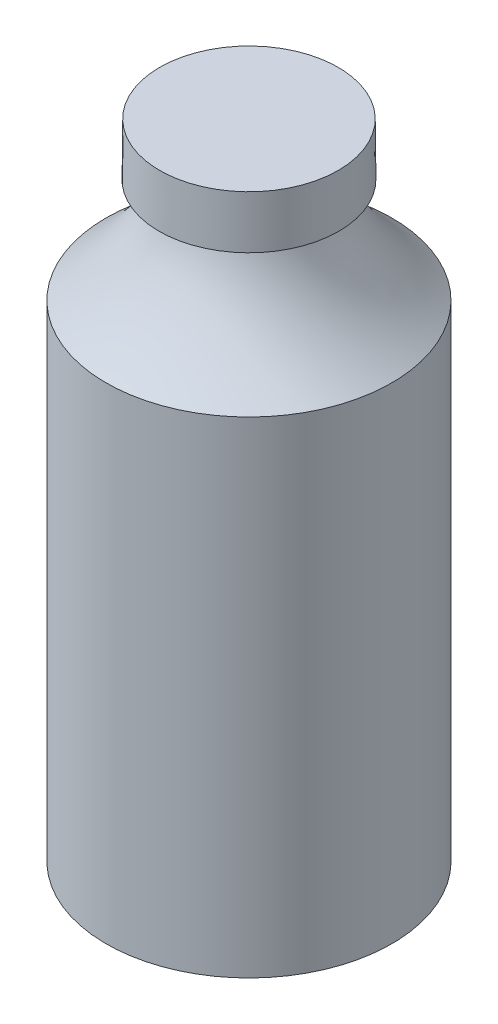
ISO-10303-21;
HEADER;
FILE_DESCRIPTION(('STEP AP214'),'2;1');
FILE_NAME('part.step','',(''),(''),'','','');
FILE_SCHEMA(('AUTOMOTIVE_DESIGN { 1 0 10303 214 1 1 1 1 }'));
ENDSEC;
DATA;
#1=APPLICATION_CONTEXT('core data for automotive mechanical design processes');
#2=APPLICATION_PROTOCOL_DEFINITION('international standard','automotive_design',2000,#1);
#3=PRODUCT_CONTEXT('',#1,'mechanical');
#4=PRODUCT('Part','Part','',(#3));
#5=PRODUCT_RELATED_PRODUCT_CATEGORY('part','',(#4));
#6=PRODUCT_DEFINITION_FORMATION('','',#4);
#7=PRODUCT_DEFINITION_CONTEXT('part definition',#1,'design');
#8=PRODUCT_DEFINITION('design','',#6,#7);
#9=PRODUCT_DEFINITION_SHAPE('','',#8);
#10=(LENGTH_UNIT() NAMED_UNIT(*) SI_UNIT(.MILLI.,.METRE.));
#11=(NAMED_UNIT(*) PLANE_ANGLE_UNIT() SI_UNIT($,.RADIAN.));
#12=(NAMED_UNIT(*) SI_UNIT($,.STERADIAN.) SOLID_ANGLE_UNIT());
#13=UNCERTAINTY_MEASURE_WITH_UNIT(LENGTH_MEASURE(1.E-05),#10,'distance_accuracy_value','');
#14=(GEOMETRIC_REPRESENTATION_CONTEXT(3) GLOBAL_UNCERTAINTY_ASSIGNED_CONTEXT((#13)) GLOBAL_UNIT_ASSIGNED_CONTEXT((#10,
#11,#12)) REPRESENTATION_CONTEXT('',''));
#15=CARTESIAN_POINT('',(0.,0.,0.));
#16=DIRECTION('',(0.,0.,1.));
#17=DIRECTION('',(1.,0.,0.));
#18=AXIS2_PLACEMENT_3D('',#15,#16,#17);
#19=CARTESIAN_POINT('',(-6.16409861325116,-111.39406779661,0.));
#20=DIRECTION('',(0.,-1.,0.));
#21=DIRECTION('',(1.,0.,0.));
#22=AXIS2_PLACEMENT_3D('',#19,#20,#21);
#23=PLANE('',#22);
#24=CARTESIAN_POINT('',(-6.16409861325116,-111.39406779661,0.));
#25=DIRECTION('',(0.,1.,0.));
#26=DIRECTION('',(-1.,0.,0.));
#27=AXIS2_PLACEMENT_3D('',#24,#25,#26);
#28=CIRCLE('',#27,50.8);
#29=CARTESIAN_POINT('',(-56.9640986132512,-111.39406779661,0.));
#30=VERTEX_POINT('',#29);
#31=EDGE_CURVE('E46',#30,#30,#28,.T.);
#32=ORIENTED_EDGE('',*,*,#31,.F.);
#33=EDGE_LOOP('',(#32));
#34=FACE_BOUND('',#33,.T.);
#35=ADVANCED_FACE('F39',(#34),#23,.T.);
#36=CARTESIAN_POINT('',(-6.16409861325119,117.20593220339,0.));
#37=DIRECTION('',(0.,1.,0.));
#38=DIRECTION('',(-1.,0.,0.));
#39=AXIS2_PLACEMENT_3D('',#36,#37,#38);
#40=CYLINDRICAL_SURFACE('',#39,50.8);
#41=ORIENTED_EDGE('',*,*,#31,.T.);
#42=EDGE_LOOP('',(#41));
#43=FACE_BOUND('',#42,.T.);
#44=CARTESIAN_POINT('',(-6.16409861325119,61.3259322033898,0.));
#45=DIRECTION('',(0.,1.,0.));
#46=DIRECTION('',(-1.,0.,0.));
#47=AXIS2_PLACEMENT_3D('',#44,#45,#46);
#48=CIRCLE('',#47,50.8);
#49=CARTESIAN_POINT('',(-56.9640986132512,61.3259322033898,0.));
#50=VERTEX_POINT('',#49);
#51=EDGE_CURVE('E50',#50,#50,#48,.T.);
#52=ORIENTED_EDGE('',*,*,#51,.F.);
#53=EDGE_LOOP('',(#52));
#54=FACE_BOUND('',#53,.T.);
#55=ADVANCED_FACE('F71',(#43,#54),#40,.T.);
#56=CARTESIAN_POINT('',(-31.5640986132512,117.20593220339,0.));
#57=CARTESIAN_POINT('',(-26.356120569538,85.7287942430536,0.));
#58=CARTESIAN_POINT('',(-56.9640986132512,61.3259322033898,0.));
#59=B_SPLINE_CURVE_WITH_KNOTS('',2,(#56,#57,#58),.UNSPECIFIED.,.F.,.F.,(3,3),(0.,1.),.UNSPECIFIED.);
#60=CARTESIAN_POINT('',(-6.16409861325119,117.20593220339,0.));
#61=DIRECTION('',(0.,1.,0.));
#62=AXIS1_PLACEMENT('',#60,#61);
#63=SURFACE_OF_REVOLUTION('',#59,#62);
#64=CARTESIAN_POINT('',(-6.16409861325119,98.5444619241905,0.));
#65=DIRECTION('',(0.,1.,0.));
#66=DIRECTION('',(-1.,0.,0.));
#67=AXIS2_PLACEMENT_3D('',#64,#65,#66);
#68=CIRCLE('',#67,25.5781666043596);
#69=CARTESIAN_POINT('',(-31.7422652176108,98.5444619241905,0.));
#70=VERTEX_POINT('',#69);
#71=EDGE_CURVE('E10',#70,#70,#68,.T.);
#72=ORIENTED_EDGE('',*,*,#71,.F.);
#73=EDGE_LOOP('',(#72));
#74=FACE_BOUND('',#73,.T.);
#75=ORIENTED_EDGE('',*,*,#51,.T.);
#76=EDGE_LOOP('',(#75));
#77=FACE_BOUND('',#76,.T.);
#78=ADVANCED_FACE('F66',(#74,#77),#63,.F.);
#79=CARTESIAN_POINT('',(-6.16409861325119,98.5444619242105,0.));
#80=DIRECTION('',(0.,-1.,0.));
#81=DIRECTION('',(1.,0.,0.));
#82=AXIS2_PLACEMENT_3D('',#79,#80,#81);
#83=CONICAL_SURFACE('',#82,31.9281666044178,0.00954700799820233);
#84=CARTESIAN_POINT('',(-6.16409861325119,117.205932119238,0.));
#85=DIRECTION('',(0.,-1.,0.));
#86=DIRECTION('',(1.,0.,0.));
#87=AXIS2_PLACEMENT_3D('',#84,#85,#86);
#88=CIRCLE('',#87,31.7499999861544);
#89=CARTESIAN_POINT('',(25.5859013729032,117.205932119238,0.));
#90=VERTEX_POINT('',#89);
#91=EDGE_CURVE('E54',#90,#90,#88,.T.);
#92=ORIENTED_EDGE('',*,*,#91,.T.);
#93=EDGE_LOOP('',(#92));
#94=FACE_BOUND('',#93,.T.);
#95=CARTESIAN_POINT('',(-6.16409861325119,98.5444619242105,0.));
#96=DIRECTION('',(0.,-1.,0.));
#97=DIRECTION('',(1.,0.,0.));
#98=AXIS2_PLACEMENT_3D('',#95,#96,#97);
#99=CIRCLE('',#98,31.9281666044178);
#100=CARTESIAN_POINT('',(25.7640679911666,98.5444619242105,0.));
#101=VERTEX_POINT('',#100);
#102=EDGE_CURVE('E125',#101,#101,#99,.T.);
#103=ORIENTED_EDGE('',*,*,#102,.F.);
#104=EDGE_LOOP('',(#103));
#105=FACE_BOUND('',#104,.T.);
#106=ADVANCED_FACE('F70',(#94,#105),#83,.T.);
#107=CARTESIAN_POINT('',(6.21979296665358E-10,98.5444619241905,0.));
#108=DIRECTION('',(0.,-1.,0.));
#109=DIRECTION('',(1.,0.,0.));
#110=AXIS2_PLACEMENT_3D('',#107,#108,#109);
#111=PLANE('',#110);
#112=ORIENTED_EDGE('',*,*,#102,.T.);
#113=EDGE_LOOP('',(#112));
#114=FACE_BOUND('',#113,.T.);
#115=ORIENTED_EDGE('',*,*,#71,.T.);
#116=EDGE_LOOP('',(#115));
#117=FACE_BOUND('',#116,.T.);
#118=ADVANCED_FACE('F97',(#114,#117),#111,.T.);
#119=CARTESIAN_POINT('',(-6.16409861325119,117.20593220339,0.));
#120=DIRECTION('',(0.,1.,0.));
#121=DIRECTION('',(-1.,0.,0.));
#122=AXIS2_PLACEMENT_3D('',#119,#120,#121);
#123=PLANE('',#122);
#124=ORIENTED_EDGE('',*,*,#91,.F.);
#125=EDGE_LOOP('',(#124));
#126=FACE_BOUND('',#125,.T.);
#127=ADVANCED_FACE('F41',(#126),#123,.T.);
#128=CLOSED_SHELL('',(#35,#55,#78,#106,#118,#127));
#129=MANIFOLD_SOLID_BREP('B2',#128);
#130=ADVANCED_BREP_SHAPE_REPRESENTATION('',(#18,#129),#14);
#131=SHAPE_DEFINITION_REPRESENTATION(#9,#130);
ENDSEC;
END-ISO-10303-21;
